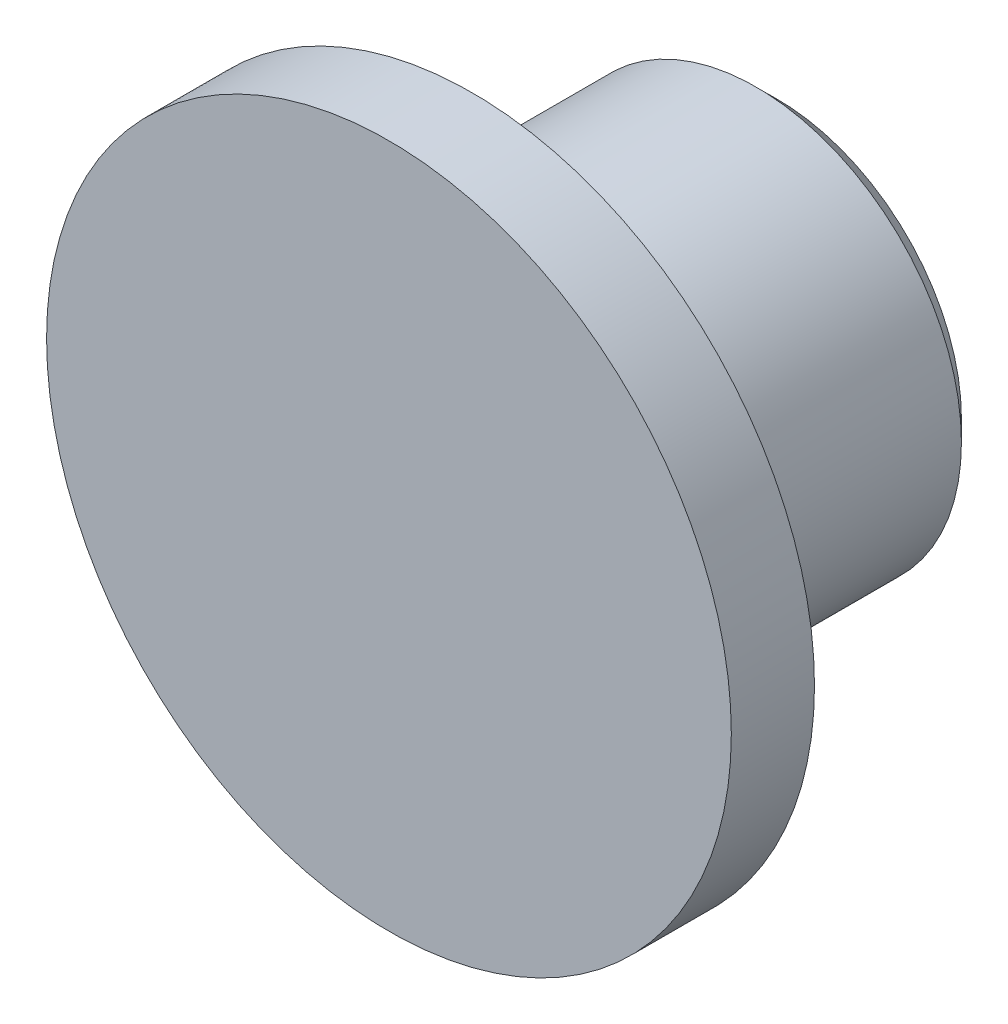
ISO-10303-21;
HEADER;
FILE_DESCRIPTION(('STEP AP214'),'2;1');
FILE_NAME('part.step','',(''),(''),'','','');
FILE_SCHEMA(('AUTOMOTIVE_DESIGN { 1 0 10303 214 1 1 1 1 }'));
ENDSEC;
DATA;
#1=APPLICATION_CONTEXT('core data for automotive mechanical design processes');
#2=APPLICATION_PROTOCOL_DEFINITION('international standard','automotive_design',2000,#1);
#3=PRODUCT_CONTEXT('',#1,'mechanical');
#4=PRODUCT('Part','Part','',(#3));
#5=PRODUCT_RELATED_PRODUCT_CATEGORY('part','',(#4));
#6=PRODUCT_DEFINITION_FORMATION('','',#4);
#7=PRODUCT_DEFINITION_CONTEXT('part definition',#1,'design');
#8=PRODUCT_DEFINITION('design','',#6,#7);
#9=PRODUCT_DEFINITION_SHAPE('','',#8);
#10=(LENGTH_UNIT() NAMED_UNIT(*) SI_UNIT(.MILLI.,.METRE.));
#11=(NAMED_UNIT(*) PLANE_ANGLE_UNIT() SI_UNIT($,.RADIAN.));
#12=(NAMED_UNIT(*) SI_UNIT($,.STERADIAN.) SOLID_ANGLE_UNIT());
#13=UNCERTAINTY_MEASURE_WITH_UNIT(LENGTH_MEASURE(1.E-05),#10,'distance_accuracy_value','');
#14=(GEOMETRIC_REPRESENTATION_CONTEXT(3) GLOBAL_UNCERTAINTY_ASSIGNED_CONTEXT((#13)) GLOBAL_UNIT_ASSIGNED_CONTEXT((#10,
#11,#12)) REPRESENTATION_CONTEXT('',''));
#15=CARTESIAN_POINT('',(0.,0.,0.));
#16=DIRECTION('',(0.,0.,1.));
#17=DIRECTION('',(1.,0.,0.));
#18=AXIS2_PLACEMENT_3D('',#15,#16,#17);
#19=CARTESIAN_POINT('',(-14.8534914230981,-1.52414854716664,-54.8040150999882));
#20=DIRECTION('',(0.,0.,1.));
#21=DIRECTION('',(1.,0.,0.));
#22=AXIS2_PLACEMENT_3D('',#19,#20,#21);
#23=PLANE('',#22);
#24=CARTESIAN_POINT('',(-14.8534914230981,-1.52414854716664,-54.8040150999882));
#25=DIRECTION('',(0.,0.,1.));
#26=DIRECTION('',(1.,0.,0.));
#27=AXIS2_PLACEMENT_3D('',#24,#25,#26);
#28=CIRCLE('',#27,1.48);
#29=CARTESIAN_POINT('',(-13.3734914230981,-1.52414854716664,-54.8040150999882));
#30=VERTEX_POINT('',#29);
#31=EDGE_CURVE('E56',#30,#30,#28,.T.);
#32=ORIENTED_EDGE('',*,*,#31,.T.);
#33=EDGE_LOOP('',(#32));
#34=FACE_BOUND('',#33,.T.);
#35=CARTESIAN_POINT('',(-14.8534914230981,-1.52414854716664,-54.8040150999882));
#36=DIRECTION('',(0.,0.,1.));
#37=DIRECTION('',(1.,0.,0.));
#38=AXIS2_PLACEMENT_3D('',#35,#36,#37);
#39=CIRCLE('',#38,2.47);
#40=CARTESIAN_POINT('',(-17.3234914230981,-1.52414854716664,-54.8040150999882));
#41=VERTEX_POINT('',#40);
#42=EDGE_CURVE('E51',#41,#41,#39,.T.);
#43=ORIENTED_EDGE('',*,*,#42,.F.);
#44=EDGE_LOOP('',(#43));
#45=FACE_BOUND('',#44,.T.);
#46=ADVANCED_FACE('F35',(#34,#45),#23,.F.);
#47=CARTESIAN_POINT('',(-14.8534914230981,-1.52414854716664,-47.2178001018651));
#48=DIRECTION('',(0.,0.,-1.));
#49=DIRECTION('',(-1.,0.,0.));
#50=AXIS2_PLACEMENT_3D('',#47,#48,#49);
#51=CYLINDRICAL_SURFACE('',#50,2.47);
#52=CARTESIAN_POINT('',(-14.8534914230981,-1.52414854716664,-54.2040150999882));
#53=DIRECTION('',(0.,0.,-1.));
#54=DIRECTION('',(-1.,0.,0.));
#55=AXIS2_PLACEMENT_3D('',#52,#53,#54);
#56=CIRCLE('',#55,2.47);
#57=CARTESIAN_POINT('',(-17.3234914230981,-1.52414854716664,-54.2040150999882));
#58=VERTEX_POINT('',#57);
#59=EDGE_CURVE('E47',#58,#58,#56,.T.);
#60=CARTESIAN_POINT('',(-17.3234914230981,-1.52414854716664,-54.2040150999882));
#61=CARTESIAN_POINT('',(-17.3234914230981,-1.52414854716664,-54.2102650999882));
#62=CARTESIAN_POINT('',(-17.3234914230981,-1.52414854716664,-54.2165150999882));
#63=CARTESIAN_POINT('',(-17.3234914230981,-1.52414854716664,-54.2290150999882));
#64=CARTESIAN_POINT('',(-17.3234914230981,-1.52414854716664,-54.2352650999882));
#65=CARTESIAN_POINT('',(-17.3234914230981,-1.52414854716664,-54.2477650999882));
#66=CARTESIAN_POINT('',(-17.3234914230981,-1.52414854716664,-54.2540150999882));
#67=CARTESIAN_POINT('',(-17.3234914230981,-1.52414854716664,-54.2665150999882));
#68=CARTESIAN_POINT('',(-17.3234914230981,-1.52414854716664,-54.2727650999882));
#69=CARTESIAN_POINT('',(-17.3234914230981,-1.52414854716664,-54.2852650999882));
#70=CARTESIAN_POINT('',(-17.3234914230981,-1.52414854716664,-54.2915150999882));
#71=CARTESIAN_POINT('',(-17.3234914230981,-1.52414854716664,-54.3040150999882));
#72=CARTESIAN_POINT('',(-17.3234914230981,-1.52414854716664,-54.3102650999882));
#73=CARTESIAN_POINT('',(-17.3234914230981,-1.52414854716664,-54.3227650999882));
#74=CARTESIAN_POINT('',(-17.3234914230981,-1.52414854716664,-54.3290150999882));
#75=CARTESIAN_POINT('',(-17.3234914230981,-1.52414854716664,-54.3415150999882));
#76=CARTESIAN_POINT('',(-17.3234914230981,-1.52414854716664,-54.3477650999882));
#77=CARTESIAN_POINT('',(-17.3234914230981,-1.52414854716664,-54.3602650999882));
#78=CARTESIAN_POINT('',(-17.3234914230981,-1.52414854716664,-54.3665150999882));
#79=CARTESIAN_POINT('',(-17.3234914230981,-1.52414854716664,-54.3790150999882));
#80=CARTESIAN_POINT('',(-17.3234914230981,-1.52414854716664,-54.3852650999882));
#81=CARTESIAN_POINT('',(-17.3234914230981,-1.52414854716664,-54.3977650999882));
#82=CARTESIAN_POINT('',(-17.3234914230981,-1.52414854716664,-54.4040150999882));
#83=CARTESIAN_POINT('',(-17.3234914230981,-1.52414854716664,-54.4165150999882));
#84=CARTESIAN_POINT('',(-17.3234914230981,-1.52414854716664,-54.4227650999882));
#85=CARTESIAN_POINT('',(-17.3234914230981,-1.52414854716664,-54.4352650999882));
#86=CARTESIAN_POINT('',(-17.3234914230981,-1.52414854716664,-54.4415150999882));
#87=CARTESIAN_POINT('',(-17.3234914230981,-1.52414854716664,-54.4540150999882));
#88=CARTESIAN_POINT('',(-17.3234914230981,-1.52414854716664,-54.4602650999882));
#89=CARTESIAN_POINT('',(-17.3234914230981,-1.52414854716664,-54.4727650999882));
#90=CARTESIAN_POINT('',(-17.3234914230981,-1.52414854716664,-54.4790150999882));
#91=CARTESIAN_POINT('',(-17.3234914230981,-1.52414854716664,-54.4915150999882));
#92=CARTESIAN_POINT('',(-17.3234914230981,-1.52414854716664,-54.4977650999882));
#93=CARTESIAN_POINT('',(-17.3234914230981,-1.52414854716664,-54.5102650999882));
#94=CARTESIAN_POINT('',(-17.3234914230981,-1.52414854716664,-54.5165150999882));
#95=CARTESIAN_POINT('',(-17.3234914230981,-1.52414854716664,-54.5290150999882));
#96=CARTESIAN_POINT('',(-17.3234914230981,-1.52414854716664,-54.5352650999882));
#97=CARTESIAN_POINT('',(-17.3234914230981,-1.52414854716664,-54.5477650999882));
#98=CARTESIAN_POINT('',(-17.3234914230981,-1.52414854716664,-54.5540150999882));
#99=CARTESIAN_POINT('',(-17.3234914230981,-1.52414854716664,-54.5665150999882));
#100=CARTESIAN_POINT('',(-17.3234914230981,-1.52414854716664,-54.5727650999882));
#101=CARTESIAN_POINT('',(-17.3234914230981,-1.52414854716664,-54.5852650999882));
#102=CARTESIAN_POINT('',(-17.3234914230981,-1.52414854716664,-54.5915150999882));
#103=CARTESIAN_POINT('',(-17.3234914230981,-1.52414854716664,-54.6040150999882));
#104=CARTESIAN_POINT('',(-17.3234914230981,-1.52414854716664,-54.6102650999882));
#105=CARTESIAN_POINT('',(-17.3234914230981,-1.52414854716664,-54.6227650999882));
#106=CARTESIAN_POINT('',(-17.3234914230981,-1.52414854716664,-54.6290150999882));
#107=CARTESIAN_POINT('',(-17.3234914230981,-1.52414854716664,-54.6415150999882));
#108=CARTESIAN_POINT('',(-17.3234914230981,-1.52414854716664,-54.6477650999882));
#109=CARTESIAN_POINT('',(-17.3234914230981,-1.52414854716664,-54.6602650999882));
#110=CARTESIAN_POINT('',(-17.3234914230981,-1.52414854716664,-54.6665150999882));
#111=CARTESIAN_POINT('',(-17.3234914230981,-1.52414854716664,-54.6790150999882));
#112=CARTESIAN_POINT('',(-17.3234914230981,-1.52414854716664,-54.6852650999882));
#113=CARTESIAN_POINT('',(-17.3234914230981,-1.52414854716664,-54.6977650999882));
#114=CARTESIAN_POINT('',(-17.3234914230981,-1.52414854716664,-54.7040150999882));
#115=CARTESIAN_POINT('',(-17.3234914230981,-1.52414854716664,-54.7165150999882));
#116=CARTESIAN_POINT('',(-17.3234914230981,-1.52414854716664,-54.7227650999882));
#117=CARTESIAN_POINT('',(-17.3234914230981,-1.52414854716664,-54.7352650999882));
#118=CARTESIAN_POINT('',(-17.3234914230981,-1.52414854716664,-54.7415150999882));
#119=CARTESIAN_POINT('',(-17.3234914230981,-1.52414854716664,-54.7540150999882));
#120=CARTESIAN_POINT('',(-17.3234914230981,-1.52414854716664,-54.7602650999882));
#121=CARTESIAN_POINT('',(-17.3234914230981,-1.52414854716664,-54.7727650999882));
#122=CARTESIAN_POINT('',(-17.3234914230981,-1.52414854716664,-54.7790150999882));
#123=CARTESIAN_POINT('',(-17.3234914230981,-1.52414854716664,-54.7915150999882));
#124=CARTESIAN_POINT('',(-17.3234914230981,-1.52414854716664,-54.7977650999882));
#125=CARTESIAN_POINT('',(-17.3234914230981,-1.52414854716664,-54.8040150999882));
#126=B_SPLINE_CURVE_WITH_KNOTS('',3,(#60,#61,#62,#63,#64,#65,#66,#67,#68,#69,#70,#71,#72,#73,
#74,#75,#76,#77,#78,#79,#80,#81,#82,#83,#84,#85,#86,#87,#88,#89,#90,#91,#92,#93,#94,#95,#96,#97,
#98,#99,#100,#101,#102,#103,#104,#105,#106,#107,#108,#109,#110,#111,#112,#113,#114,#115,#116,
#117,#118,#119,#120,#121,#122,#123,#124,#125),.UNSPECIFIED.,.F.,.F.,(4,2,2,2,2,2,2,2,2,2,2,2,2,
2,2,2,2,2,2,2,2,2,2,2,2,2,2,2,2,2,2,2,4),(0.,0.0187500000000049,0.0375000000000028,
0.0562500000000007,0.0750000000000056,0.0937500000000036,0.112500000000001,0.131250000000006,
0.150000000000004,0.168750000000002,0.1875,0.206250000000005,0.225000000000003,
0.243750000000001,0.262500000000006,0.281250000000004,0.300000000000002,0.318750000000007,
0.337500000000004,0.356250000000002,0.375000000000007,0.393750000000005,0.412500000000003,
0.431250000000008,0.450000000000006,0.468750000000004,0.487500000000009,0.506250000000007,
0.525000000000005,0.543750000000003,0.562500000000007,0.581250000000005,0.600000000000003),.UNSPECIFIED.);
#127=EDGE_CURVE('BSEAM72',#58,#41,#126,.T.);
#128=ORIENTED_EDGE('',*,*,#59,.T.);
#129=ORIENTED_EDGE('',*,*,#42,.T.);
#130=ORIENTED_EDGE('',*,*,#127,.T.);
#131=ORIENTED_EDGE('',*,*,#127,.F.);
#132=EDGE_LOOP('',(#128,#130,#129,#131));
#133=FACE_BOUND('',#132,.T.);
#134=ADVANCED_FACE('F72',(#133),#51,.T.);
#135=CARTESIAN_POINT('',(-20.0284944138201,2.42684925556836,-54.2040150999882));
#136=DIRECTION('',(0.,0.,-1.));
#137=DIRECTION('',(-1.,0.,0.));
#138=AXIS2_PLACEMENT_3D('',#135,#136,#137);
#139=PLANE('',#138);
#140=ORIENTED_EDGE('',*,*,#59,.F.);
#141=EDGE_LOOP('',(#140));
#142=FACE_BOUND('',#141,.T.);
#143=ADVANCED_FACE('F65',(#142),#139,.F.);
#144=CARTESIAN_POINT('',(-14.8534914230981,-1.52414854716664,-57.0040150999882));
#145=DIRECTION('',(0.,0.,1.));
#146=DIRECTION('',(1.,0.,0.));
#147=AXIS2_PLACEMENT_3D('',#144,#145,#146);
#148=CYLINDRICAL_SURFACE('',#147,1.48);
#149=CARTESIAN_POINT('',(-14.8534914230981,-1.52414854716664,-56.8540150999882));
#150=DIRECTION('',(0.,0.,1.));
#151=DIRECTION('',(1.,0.,0.));
#152=AXIS2_PLACEMENT_3D('',#149,#150,#151);
#153=CIRCLE('',#152,1.48);
#154=CARTESIAN_POINT('',(-13.3734914230981,-1.52414854716664,-56.8540150999882));
#155=VERTEX_POINT('',#154);
#156=EDGE_CURVE('E43',#155,#155,#153,.T.);
#157=ORIENTED_EDGE('',*,*,#156,.T.);
#158=EDGE_LOOP('',(#157));
#159=FACE_BOUND('',#158,.T.);
#160=ORIENTED_EDGE('',*,*,#31,.F.);
#161=EDGE_LOOP('',(#160));
#162=FACE_BOUND('',#161,.T.);
#163=ADVANCED_FACE('F62',(#159,#162),#148,.T.);
#164=CARTESIAN_POINT('',(-14.8534914230981,-1.52414854716664,-57.0040150999882));
#165=DIRECTION('',(0.,0.,1.));
#166=DIRECTION('',(1.,0.,0.));
#167=AXIS2_PLACEMENT_3D('',#164,#165,#166);
#168=PLANE('',#167);
#169=CARTESIAN_POINT('',(-14.8534914230981,-1.52414854716664,-57.0040150999882));
#170=DIRECTION('',(0.,0.,1.));
#171=DIRECTION('',(1.,0.,0.));
#172=AXIS2_PLACEMENT_3D('',#169,#170,#171);
#173=CIRCLE('',#172,1.33);
#174=CARTESIAN_POINT('',(-13.5234914230981,-1.52414854716664,-57.0040150999882));
#175=VERTEX_POINT('',#174);
#176=EDGE_CURVE('E10',#175,#175,#173,.F.);
#177=ORIENTED_EDGE('',*,*,#176,.T.);
#178=EDGE_LOOP('',(#177));
#179=FACE_BOUND('',#178,.T.);
#180=ADVANCED_FACE('F64',(#179),#168,.F.);
#181=CARTESIAN_POINT('',(-14.8534914230981,-1.52414854716664,-56.8540150999882));
#182=DIRECTION('',(0.,0.,1.));
#183=DIRECTION('',(1.,0.,0.));
#184=AXIS2_PLACEMENT_3D('',#181,#182,#183);
#185=CONICAL_SURFACE('',#184,1.48,0.785398163397443);
#186=ORIENTED_EDGE('',*,*,#176,.F.);
#187=EDGE_LOOP('',(#186));
#188=FACE_BOUND('',#187,.T.);
#189=ORIENTED_EDGE('',*,*,#156,.F.);
#190=EDGE_LOOP('',(#189));
#191=FACE_BOUND('',#190,.T.);
#192=ADVANCED_FACE('F38',(#188,#191),#185,.T.);
#193=CLOSED_SHELL('',(#46,#134,#143,#163,#180,#192));
#194=MANIFOLD_SOLID_BREP('B2',#193);
#195=ADVANCED_BREP_SHAPE_REPRESENTATION('',(#18,#194),#14);
#196=SHAPE_DEFINITION_REPRESENTATION(#9,#195);
ENDSEC;
END-ISO-10303-21;
